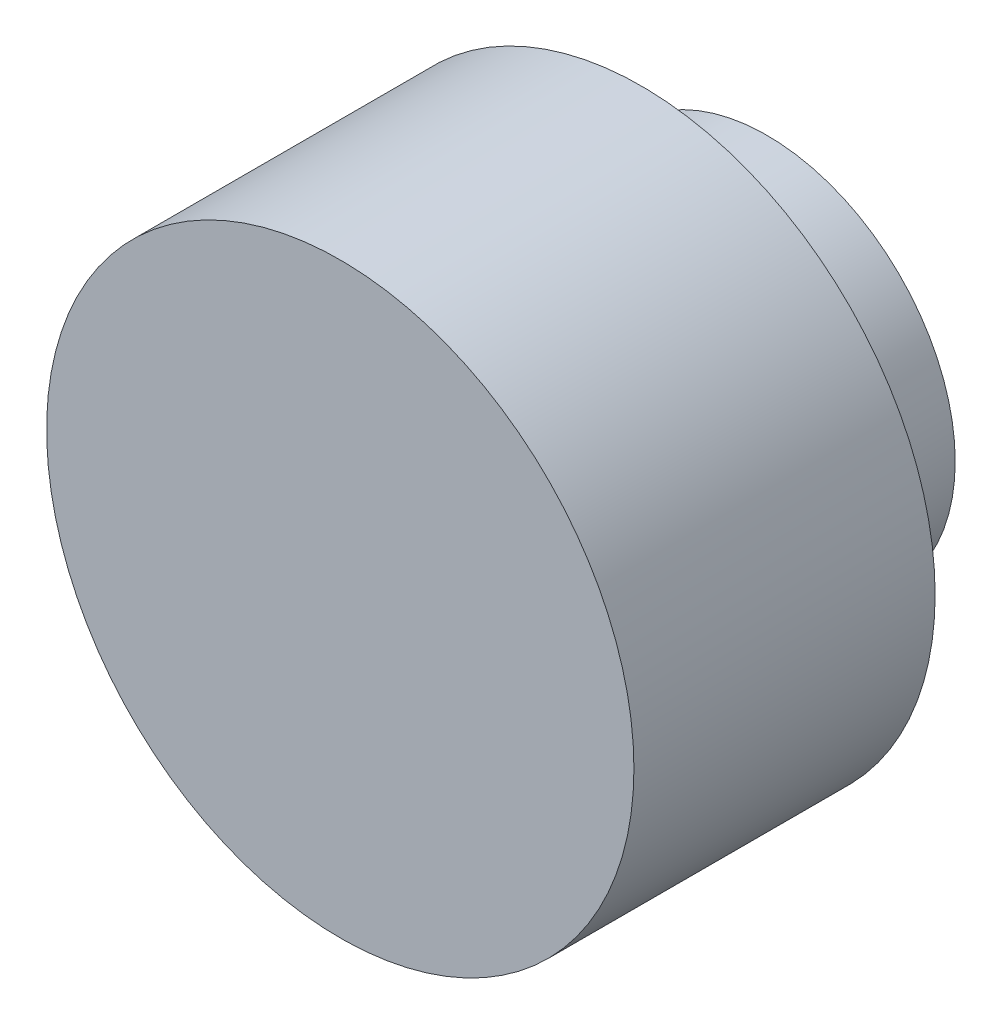
ISO-10303-21;
HEADER;
FILE_DESCRIPTION(('STEP AP214'),'2;1');
FILE_NAME('part.step','',(''),(''),'','','');
FILE_SCHEMA(('AUTOMOTIVE_DESIGN { 1 0 10303 214 1 1 1 1 }'));
ENDSEC;
DATA;
#1=APPLICATION_CONTEXT('core data for automotive mechanical design processes');
#2=APPLICATION_PROTOCOL_DEFINITION('international standard','automotive_design',2000,#1);
#3=PRODUCT_CONTEXT('',#1,'mechanical');
#4=PRODUCT('Part','Part','',(#3));
#5=PRODUCT_RELATED_PRODUCT_CATEGORY('part','',(#4));
#6=PRODUCT_DEFINITION_FORMATION('','',#4);
#7=PRODUCT_DEFINITION_CONTEXT('part definition',#1,'design');
#8=PRODUCT_DEFINITION('design','',#6,#7);
#9=PRODUCT_DEFINITION_SHAPE('','',#8);
#10=(LENGTH_UNIT() NAMED_UNIT(*) SI_UNIT(.MILLI.,.METRE.));
#11=(NAMED_UNIT(*) PLANE_ANGLE_UNIT() SI_UNIT($,.RADIAN.));
#12=(NAMED_UNIT(*) SI_UNIT($,.STERADIAN.) SOLID_ANGLE_UNIT());
#13=UNCERTAINTY_MEASURE_WITH_UNIT(LENGTH_MEASURE(1.E-05),#10,'distance_accuracy_value','');
#14=(GEOMETRIC_REPRESENTATION_CONTEXT(3) GLOBAL_UNCERTAINTY_ASSIGNED_CONTEXT((#13)) GLOBAL_UNIT_ASSIGNED_CONTEXT((#10,
#11,#12)) REPRESENTATION_CONTEXT('',''));
#15=CARTESIAN_POINT('',(0.,0.,0.));
#16=DIRECTION('',(0.,0.,1.));
#17=DIRECTION('',(1.,0.,0.));
#18=AXIS2_PLACEMENT_3D('',#15,#16,#17);
#19=CARTESIAN_POINT('',(73.8919870495017,7.91818044227841,3.));
#20=DIRECTION('',(0.,0.,-1.));
#21=DIRECTION('',(-1.,0.,0.));
#22=AXIS2_PLACEMENT_3D('',#19,#20,#21);
#23=CYLINDRICAL_SURFACE('',#22,2.92499999999917);
#24=CARTESIAN_POINT('',(73.8919870495017,7.91818044227841,3.));
#25=DIRECTION('',(0.,0.,1.));
#26=DIRECTION('',(1.,0.,0.));
#27=AXIS2_PLACEMENT_3D('',#24,#25,#26);
#28=CIRCLE('',#27,2.92499999999917);
#29=CARTESIAN_POINT('',(76.8169870495009,7.91818044227841,3.));
#30=VERTEX_POINT('',#29);
#31=EDGE_CURVE('E10',#30,#30,#28,.T.);
#32=ORIENTED_EDGE('',*,*,#31,.F.);
#33=EDGE_LOOP('',(#32));
#34=FACE_BOUND('',#33,.T.);
#35=CARTESIAN_POINT('',(73.8919870495017,7.91818044227841,0.));
#36=DIRECTION('',(0.,0.,1.));
#37=DIRECTION('',(1.,0.,0.));
#38=AXIS2_PLACEMENT_3D('',#35,#36,#37);
#39=CIRCLE('',#38,2.92499999999917);
#40=CARTESIAN_POINT('',(76.8169870495009,7.91818044227841,0.));
#41=VERTEX_POINT('',#40);
#42=EDGE_CURVE('E45',#41,#41,#39,.T.);
#43=ORIENTED_EDGE('',*,*,#42,.T.);
#44=EDGE_LOOP('',(#43));
#45=FACE_BOUND('',#44,.T.);
#46=ADVANCED_FACE('F39',(#34,#45),#23,.T.);
#47=CARTESIAN_POINT('',(0.,0.,3.));
#48=DIRECTION('',(0.,0.,1.));
#49=DIRECTION('',(1.,0.,0.));
#50=AXIS2_PLACEMENT_3D('',#47,#48,#49);
#51=PLANE('',#50);
#52=ORIENTED_EDGE('',*,*,#31,.T.);
#53=EDGE_LOOP('',(#52));
#54=FACE_BOUND('',#53,.T.);
#55=ADVANCED_FACE('F69',(#54),#51,.T.);
#56=CARTESIAN_POINT('',(0.,0.,0.));
#57=DIRECTION('',(0.,0.,1.));
#58=DIRECTION('',(1.,0.,0.));
#59=AXIS2_PLACEMENT_3D('',#56,#57,#58);
#60=PLANE('',#59);
#61=CARTESIAN_POINT('',(73.8919870495017,7.91818044227841,0.));
#62=DIRECTION('',(0.,0.,1.));
#63=DIRECTION('',(1.,0.,0.));
#64=AXIS2_PLACEMENT_3D('',#61,#62,#63);
#65=CIRCLE('',#64,1.875);
#66=CARTESIAN_POINT('',(75.7669870495017,7.91818044227841,0.));
#67=VERTEX_POINT('',#66);
#68=EDGE_CURVE('E51',#67,#67,#65,.T.);
#69=ORIENTED_EDGE('',*,*,#68,.T.);
#70=EDGE_LOOP('',(#69));
#71=FACE_BOUND('',#70,.T.);
#72=ORIENTED_EDGE('',*,*,#42,.F.);
#73=EDGE_LOOP('',(#72));
#74=FACE_BOUND('',#73,.T.);
#75=ADVANCED_FACE('F67',(#71,#74),#60,.F.);
#76=CARTESIAN_POINT('',(73.8919870495017,7.91818044227841,-1.25));
#77=DIRECTION('',(0.,0.,1.));
#78=DIRECTION('',(1.,0.,0.));
#79=AXIS2_PLACEMENT_3D('',#76,#77,#78);
#80=CYLINDRICAL_SURFACE('',#79,1.875);
#81=CARTESIAN_POINT('',(73.8919870495017,7.91818044227841,-1.25));
#82=DIRECTION('',(0.,0.,1.));
#83=DIRECTION('',(1.,0.,0.));
#84=AXIS2_PLACEMENT_3D('',#81,#82,#83);
#85=CIRCLE('',#84,1.875);
#86=CARTESIAN_POINT('',(75.7669870495017,7.91818044227841,-1.25));
#87=VERTEX_POINT('',#86);
#88=EDGE_CURVE('E47',#87,#87,#85,.T.);
#89=ORIENTED_EDGE('',*,*,#88,.T.);
#90=EDGE_LOOP('',(#89));
#91=FACE_BOUND('',#90,.T.);
#92=ORIENTED_EDGE('',*,*,#68,.F.);
#93=EDGE_LOOP('',(#92));
#94=FACE_BOUND('',#93,.T.);
#95=ADVANCED_FACE('F60',(#91,#94),#80,.T.);
#96=CARTESIAN_POINT('',(0.,0.,-1.25));
#97=DIRECTION('',(0.,0.,1.));
#98=DIRECTION('',(1.,0.,0.));
#99=AXIS2_PLACEMENT_3D('',#96,#97,#98);
#100=PLANE('',#99);
#101=ORIENTED_EDGE('',*,*,#88,.F.);
#102=EDGE_LOOP('',(#101));
#103=FACE_BOUND('',#102,.T.);
#104=ADVANCED_FACE('F58',(#103),#100,.F.);
#105=CLOSED_SHELL('',(#46,#55,#75,#95,#104));
#106=MANIFOLD_SOLID_BREP('B2',#105);
#107=ADVANCED_BREP_SHAPE_REPRESENTATION('',(#18,#106),#14);
#108=SHAPE_DEFINITION_REPRESENTATION(#9,#107);
ENDSEC;
END-ISO-10303-21;
